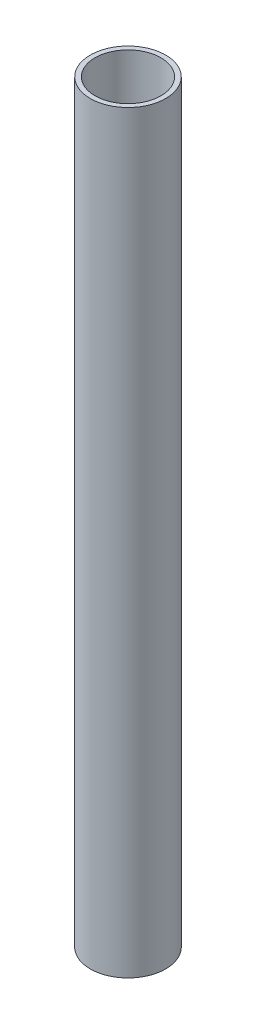
ISO-10303-21;
HEADER;
FILE_DESCRIPTION(('STEP AP214'),'2;1');
FILE_NAME('part.step','',(''),(''),'','','');
FILE_SCHEMA(('AUTOMOTIVE_DESIGN { 1 0 10303 214 1 1 1 1 }'));
ENDSEC;
DATA;
#1=APPLICATION_CONTEXT('core data for automotive mechanical design processes');
#2=APPLICATION_PROTOCOL_DEFINITION('international standard','automotive_design',2000,#1);
#3=PRODUCT_CONTEXT('',#1,'mechanical');
#4=PRODUCT('Part','Part','',(#3));
#5=PRODUCT_RELATED_PRODUCT_CATEGORY('part','',(#4));
#6=PRODUCT_DEFINITION_FORMATION('','',#4);
#7=PRODUCT_DEFINITION_CONTEXT('part definition',#1,'design');
#8=PRODUCT_DEFINITION('design','',#6,#7);
#9=PRODUCT_DEFINITION_SHAPE('','',#8);
#10=(LENGTH_UNIT() NAMED_UNIT(*) SI_UNIT(.MILLI.,.METRE.));
#11=(NAMED_UNIT(*) PLANE_ANGLE_UNIT() SI_UNIT($,.RADIAN.));
#12=(NAMED_UNIT(*) SI_UNIT($,.STERADIAN.) SOLID_ANGLE_UNIT());
#13=UNCERTAINTY_MEASURE_WITH_UNIT(LENGTH_MEASURE(1.E-05),#10,'distance_accuracy_value','');
#14=(GEOMETRIC_REPRESENTATION_CONTEXT(3) GLOBAL_UNCERTAINTY_ASSIGNED_CONTEXT((#13)) GLOBAL_UNIT_ASSIGNED_CONTEXT((#10,
#11,#12)) REPRESENTATION_CONTEXT('',''));
#15=CARTESIAN_POINT('',(0.,0.,0.));
#16=DIRECTION('',(0.,0.,1.));
#17=DIRECTION('',(1.,0.,0.));
#18=AXIS2_PLACEMENT_3D('',#15,#16,#17);
#19=CARTESIAN_POINT('',(0.,160.,0.));
#20=DIRECTION('',(0.,1.,0.));
#21=DIRECTION('',(0.,0.,1.));
#22=AXIS2_PLACEMENT_3D('',#19,#20,#21);
#23=PLANE('',#22);
#24=CARTESIAN_POINT('',(0.,160.,0.));
#25=DIRECTION('',(0.,1.,0.));
#26=DIRECTION('',(0.,0.,1.));
#27=AXIS2_PLACEMENT_3D('',#24,#25,#26);
#28=CIRCLE('',#27,8.);
#29=CARTESIAN_POINT('',(0.,160.,8.));
#30=VERTEX_POINT('',#29);
#31=EDGE_CURVE('E10',#30,#30,#28,.T.);
#32=ORIENTED_EDGE('',*,*,#31,.T.);
#33=EDGE_LOOP('',(#32));
#34=FACE_BOUND('',#33,.T.);
#35=CARTESIAN_POINT('',(0.,160.,0.));
#36=DIRECTION('',(0.,1.,0.));
#37=DIRECTION('',(0.,0.,1.));
#38=AXIS2_PLACEMENT_3D('',#35,#36,#37);
#39=CIRCLE('',#38,7.);
#40=CARTESIAN_POINT('',(0.,160.,7.));
#41=VERTEX_POINT('',#40);
#42=EDGE_CURVE('E50',#41,#41,#39,.T.);
#43=ORIENTED_EDGE('',*,*,#42,.F.);
#44=EDGE_LOOP('',(#43));
#45=FACE_BOUND('',#44,.T.);
#46=ADVANCED_FACE('F37',(#34,#45),#23,.T.);
#47=CARTESIAN_POINT('',(0.,0.,0.));
#48=DIRECTION('',(0.,1.,0.));
#49=DIRECTION('',(0.,0.,1.));
#50=AXIS2_PLACEMENT_3D('',#47,#48,#49);
#51=PLANE('',#50);
#52=CARTESIAN_POINT('',(0.,0.,0.));
#53=DIRECTION('',(0.,1.,0.));
#54=DIRECTION('',(0.,0.,1.));
#55=AXIS2_PLACEMENT_3D('',#52,#53,#54);
#56=CIRCLE('',#55,8.);
#57=CARTESIAN_POINT('',(0.,0.,8.));
#58=VERTEX_POINT('',#57);
#59=EDGE_CURVE('E41',#58,#58,#56,.T.);
#60=ORIENTED_EDGE('',*,*,#59,.F.);
#61=EDGE_LOOP('',(#60));
#62=FACE_BOUND('',#61,.T.);
#63=CARTESIAN_POINT('',(0.,0.,0.));
#64=DIRECTION('',(0.,1.,0.));
#65=DIRECTION('',(0.,0.,1.));
#66=AXIS2_PLACEMENT_3D('',#63,#64,#65);
#67=CIRCLE('',#66,7.);
#68=CARTESIAN_POINT('',(0.,0.,7.));
#69=VERTEX_POINT('',#68);
#70=EDGE_CURVE('E52',#69,#69,#67,.T.);
#71=ORIENTED_EDGE('',*,*,#70,.T.);
#72=EDGE_LOOP('',(#71));
#73=FACE_BOUND('',#72,.T.);
#74=ADVANCED_FACE('F64',(#62,#73),#51,.F.);
#75=CARTESIAN_POINT('',(0.,160.,0.));
#76=DIRECTION('',(0.,-1.,0.));
#77=DIRECTION('',(0.,0.,-1.));
#78=AXIS2_PLACEMENT_3D('',#75,#76,#77);
#79=CYLINDRICAL_SURFACE('',#78,8.);
#80=ORIENTED_EDGE('',*,*,#31,.F.);
#81=EDGE_LOOP('',(#80));
#82=FACE_BOUND('',#81,.T.);
#83=ORIENTED_EDGE('',*,*,#59,.T.);
#84=EDGE_LOOP('',(#83));
#85=FACE_BOUND('',#84,.T.);
#86=ADVANCED_FACE('F39',(#82,#85),#79,.T.);
#87=CARTESIAN_POINT('',(0.,160.,0.));
#88=DIRECTION('',(0.,-1.,0.));
#89=DIRECTION('',(0.,0.,-1.));
#90=AXIS2_PLACEMENT_3D('',#87,#88,#89);
#91=CYLINDRICAL_SURFACE('',#90,7.);
#92=ORIENTED_EDGE('',*,*,#42,.T.);
#93=EDGE_LOOP('',(#92));
#94=FACE_BOUND('',#93,.T.);
#95=ORIENTED_EDGE('',*,*,#70,.F.);
#96=EDGE_LOOP('',(#95));
#97=FACE_BOUND('',#96,.T.);
#98=ADVANCED_FACE('F60',(#94,#97),#91,.F.);
#99=CLOSED_SHELL('',(#46,#74,#86,#98));
#100=MANIFOLD_SOLID_BREP('B2',#99);
#101=ADVANCED_BREP_SHAPE_REPRESENTATION('',(#18,#100),#14);
#102=SHAPE_DEFINITION_REPRESENTATION(#9,#101);
ENDSEC;
END-ISO-10303-21;
